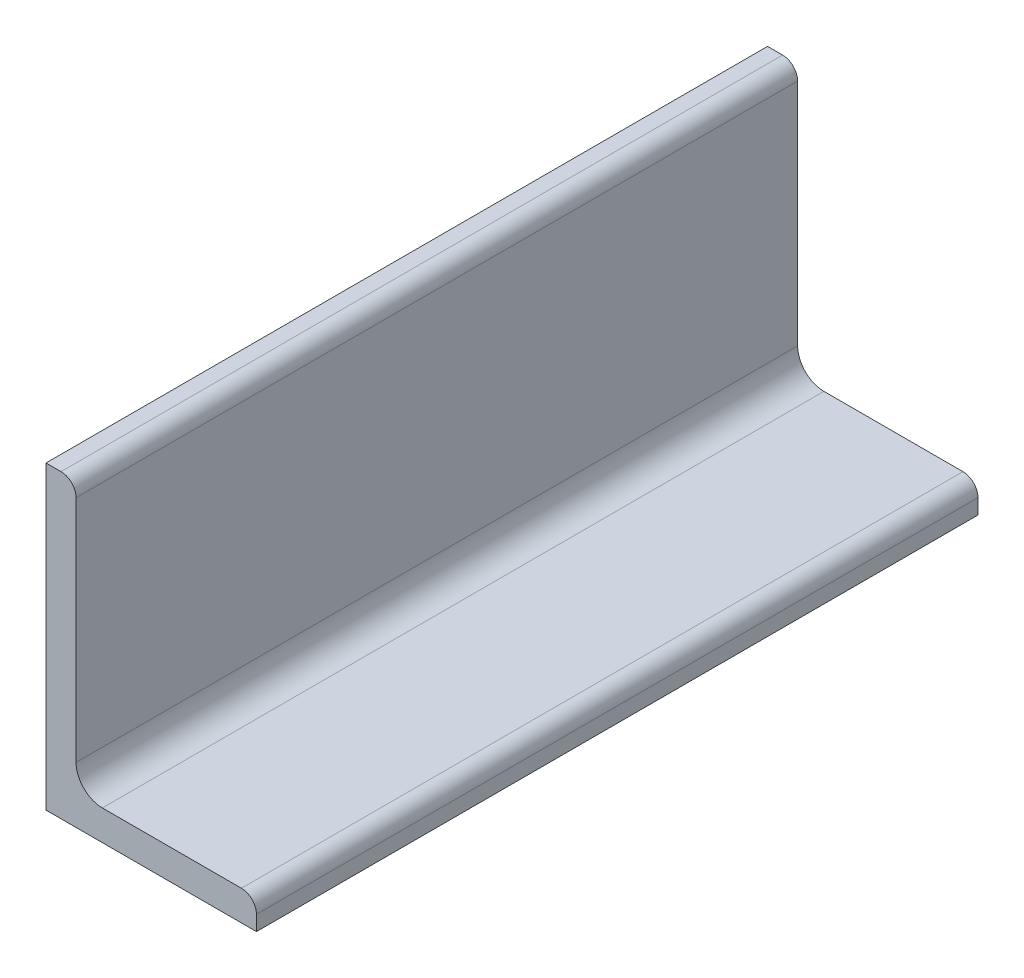
ISO-10303-21;
HEADER;
FILE_DESCRIPTION(('STEP AP214'),'2;1');
FILE_NAME('part.step','',(''),(''),'','','');
FILE_SCHEMA(('AUTOMOTIVE_DESIGN { 1 0 10303 214 1 1 1 1 }'));
ENDSEC;
DATA;
#1=APPLICATION_CONTEXT('core data for automotive mechanical design processes');
#2=APPLICATION_PROTOCOL_DEFINITION('international standard','automotive_design',2000,#1);
#3=PRODUCT_CONTEXT('',#1,'mechanical');
#4=PRODUCT('Part','Part','',(#3));
#5=PRODUCT_RELATED_PRODUCT_CATEGORY('part','',(#4));
#6=PRODUCT_DEFINITION_FORMATION('','',#4);
#7=PRODUCT_DEFINITION_CONTEXT('part definition',#1,'design');
#8=PRODUCT_DEFINITION('design','',#6,#7);
#9=PRODUCT_DEFINITION_SHAPE('','',#8);
#10=(LENGTH_UNIT() NAMED_UNIT(*) SI_UNIT(.MILLI.,.METRE.));
#11=(NAMED_UNIT(*) PLANE_ANGLE_UNIT() SI_UNIT($,.RADIAN.));
#12=(NAMED_UNIT(*) SI_UNIT($,.STERADIAN.) SOLID_ANGLE_UNIT());
#13=UNCERTAINTY_MEASURE_WITH_UNIT(LENGTH_MEASURE(1.E-05),#10,'distance_accuracy_value','');
#14=(GEOMETRIC_REPRESENTATION_CONTEXT(3) GLOBAL_UNCERTAINTY_ASSIGNED_CONTEXT((#13)) GLOBAL_UNIT_ASSIGNED_CONTEXT((#10,
#11,#12)) REPRESENTATION_CONTEXT('',''));
#15=CARTESIAN_POINT('',(0.,0.,0.));
#16=DIRECTION('',(0.,0.,1.));
#17=DIRECTION('',(1.,0.,0.));
#18=AXIS2_PLACEMENT_3D('',#15,#16,#17);
#19=CARTESIAN_POINT('',(0.0836264027816469,127.041655270204,304.8));
#20=DIRECTION('',(1.,0.,0.));
#21=DIRECTION('',(0.,0.,-1.));
#22=AXIS2_PLACEMENT_3D('',#19,#20,#21);
#23=PLANE('',#22);
#24=DIRECTION('',(0.,-1.,0.));
#25=VECTOR('',#24,1.);
#26=CARTESIAN_POINT('',(0.0836264027816469,127.041655270204,0.));
#27=LINE('',#26,#25);
#28=CARTESIAN_POINT('',(0.0836264027816469,127.041655270204,0.));
#29=VERTEX_POINT('',#28);
#30=CARTESIAN_POINT('',(0.0836264027816469,0.0416552702040917,0.));
#31=VERTEX_POINT('',#30);
#32=EDGE_CURVE('E135',#29,#31,#27,.T.);
#33=ORIENTED_EDGE('',*,*,#32,.T.);
#34=DIRECTION('',(0.,0.,-1.));
#35=VECTOR('',#34,1.);
#36=CARTESIAN_POINT('',(0.0836264027816469,0.0416552702040917,304.8));
#37=LINE('',#36,#35);
#38=CARTESIAN_POINT('',(0.0836264027816469,0.0416552702040917,304.8));
#39=VERTEX_POINT('',#38);
#40=EDGE_CURVE('E11',#39,#31,#37,.T.);
#41=ORIENTED_EDGE('',*,*,#40,.F.);
#42=DIRECTION('',(0.,-1.,0.));
#43=VECTOR('',#42,1.);
#44=CARTESIAN_POINT('',(0.0836264027816469,127.041655270204,304.8));
#45=LINE('',#44,#43);
#46=CARTESIAN_POINT('',(0.0836264027816469,127.041655270204,304.8));
#47=VERTEX_POINT('',#46);
#48=EDGE_CURVE('E151',#47,#39,#45,.T.);
#49=ORIENTED_EDGE('',*,*,#48,.F.);
#50=DIRECTION('',(0.,0.,-1.));
#51=VECTOR('',#50,1.);
#52=CARTESIAN_POINT('',(0.0836264027816469,127.041655270204,304.8));
#53=LINE('',#52,#51);
#54=EDGE_CURVE('E131',#47,#29,#53,.T.);
#55=ORIENTED_EDGE('',*,*,#54,.T.);
#56=EDGE_LOOP('',(#33,#41,#49,#55));
#57=FACE_BOUND('',#56,.T.);
#58=ADVANCED_FACE('F33',(#57),#23,.F.);
#59=CARTESIAN_POINT('',(0.0836264027816469,0.0416552702040917,304.8));
#60=DIRECTION('',(0.,1.,0.));
#61=DIRECTION('',(0.,0.,1.));
#62=AXIS2_PLACEMENT_3D('',#59,#60,#61);
#63=PLANE('',#62);
#64=DIRECTION('',(1.,0.,0.));
#65=VECTOR('',#64,1.);
#66=CARTESIAN_POINT('',(0.0836264027816469,0.0416552702040917,0.));
#67=LINE('',#66,#65);
#68=CARTESIAN_POINT('',(88.9836264027817,0.0416552702040917,0.));
#69=VERTEX_POINT('',#68);
#70=EDGE_CURVE('E138',#31,#69,#67,.T.);
#71=ORIENTED_EDGE('',*,*,#70,.T.);
#72=DIRECTION('',(0.,0.,-1.));
#73=VECTOR('',#72,1.);
#74=CARTESIAN_POINT('',(88.9836264027817,0.0416552702040917,304.8));
#75=LINE('',#74,#73);
#76=CARTESIAN_POINT('',(88.9836264027817,0.0416552702040917,304.8));
#77=VERTEX_POINT('',#76);
#78=EDGE_CURVE('E41',#77,#69,#75,.T.);
#79=ORIENTED_EDGE('',*,*,#78,.F.);
#80=DIRECTION('',(1.,0.,0.));
#81=VECTOR('',#80,1.);
#82=CARTESIAN_POINT('',(0.0836264027816469,0.0416552702040917,304.8));
#83=LINE('',#82,#81);
#84=EDGE_CURVE('E95',#39,#77,#83,.T.);
#85=ORIENTED_EDGE('',*,*,#84,.F.);
#86=ORIENTED_EDGE('',*,*,#40,.T.);
#87=EDGE_LOOP('',(#71,#79,#85,#86));
#88=FACE_BOUND('',#87,.T.);
#89=ADVANCED_FACE('F194',(#88),#63,.F.);
#90=CARTESIAN_POINT('',(88.9836264027817,0.0416552702040917,304.8));
#91=DIRECTION('',(-1.,0.,0.));
#92=DIRECTION('',(0.,0.,1.));
#93=AXIS2_PLACEMENT_3D('',#90,#91,#92);
#94=PLANE('',#93);
#95=DIRECTION('',(0.,1.,0.));
#96=VECTOR('',#95,1.);
#97=CARTESIAN_POINT('',(88.9836264027817,0.0416552702040917,0.));
#98=LINE('',#97,#96);
#99=CARTESIAN_POINT('',(88.9836264027817,6.39165527020409,0.));
#100=VERTEX_POINT('',#99);
#101=EDGE_CURVE('E140',#69,#100,#98,.T.);
#102=ORIENTED_EDGE('',*,*,#101,.T.);
#103=DIRECTION('',(0.,0.,-1.));
#104=VECTOR('',#103,1.);
#105=CARTESIAN_POINT('',(88.9836264027817,6.39165527020409,304.8));
#106=LINE('',#105,#104);
#107=CARTESIAN_POINT('',(88.9836264027817,6.39165527020409,304.8));
#108=VERTEX_POINT('',#107);
#109=EDGE_CURVE('E161',#108,#100,#106,.T.);
#110=ORIENTED_EDGE('',*,*,#109,.F.);
#111=DIRECTION('',(0.,1.,0.));
#112=VECTOR('',#111,1.);
#113=CARTESIAN_POINT('',(88.9836264027817,0.0416552702040917,304.8));
#114=LINE('',#113,#112);
#115=EDGE_CURVE('E169',#77,#108,#114,.T.);
#116=ORIENTED_EDGE('',*,*,#115,.F.);
#117=ORIENTED_EDGE('',*,*,#78,.T.);
#118=EDGE_LOOP('',(#102,#110,#116,#117));
#119=FACE_BOUND('',#118,.T.);
#120=ADVANCED_FACE('F167',(#119),#94,.F.);
#121=CARTESIAN_POINT('',(82.6336264027816,6.39165527020409,304.8));
#122=DIRECTION('',(0.,0.,-1.));
#123=DIRECTION('',(-1.,0.,0.));
#124=AXIS2_PLACEMENT_3D('',#121,#122,#123);
#125=CYLINDRICAL_SURFACE('',#124,6.35);
#126=CARTESIAN_POINT('',(82.6336264027816,6.39165527020409,0.));
#127=DIRECTION('',(0.,0.,1.));
#128=DIRECTION('',(1.,0.,0.));
#129=AXIS2_PLACEMENT_3D('',#126,#127,#128);
#130=CIRCLE('',#129,6.35);
#131=CARTESIAN_POINT('',(82.6336264027816,12.7416552702041,0.));
#132=VERTEX_POINT('',#131);
#133=EDGE_CURVE('E142',#100,#132,#130,.T.);
#134=ORIENTED_EDGE('',*,*,#133,.T.);
#135=DIRECTION('',(0.,0.,-1.));
#136=VECTOR('',#135,1.);
#137=CARTESIAN_POINT('',(82.6336264027816,12.7416552702041,304.8));
#138=LINE('',#137,#136);
#139=CARTESIAN_POINT('',(82.6336264027816,12.7416552702041,304.8));
#140=VERTEX_POINT('',#139);
#141=EDGE_CURVE('E158',#140,#132,#138,.T.);
#142=ORIENTED_EDGE('',*,*,#141,.F.);
#143=CARTESIAN_POINT('',(82.6336264027816,6.39165527020409,304.8));
#144=DIRECTION('',(0.,0.,1.));
#145=DIRECTION('',(1.,0.,0.));
#146=AXIS2_PLACEMENT_3D('',#143,#144,#145);
#147=CIRCLE('',#146,6.35);
#148=EDGE_CURVE('E185',#108,#140,#147,.T.);
#149=ORIENTED_EDGE('',*,*,#148,.F.);
#150=ORIENTED_EDGE('',*,*,#109,.T.);
#151=EDGE_LOOP('',(#134,#142,#149,#150));
#152=FACE_BOUND('',#151,.T.);
#153=ADVANCED_FACE('F178',(#152),#125,.T.);
#154=CARTESIAN_POINT('',(82.6336264027816,12.7416552702041,304.8));
#155=DIRECTION('',(0.,-1.,0.));
#156=DIRECTION('',(0.,0.,-1.));
#157=AXIS2_PLACEMENT_3D('',#154,#155,#156);
#158=PLANE('',#157);
#159=DIRECTION('',(-1.,0.,0.));
#160=VECTOR('',#159,1.);
#161=CARTESIAN_POINT('',(82.6336264027816,12.7416552702041,0.));
#162=LINE('',#161,#160);
#163=CARTESIAN_POINT('',(23.8961264027816,12.7416552702041,0.));
#164=VERTEX_POINT('',#163);
#165=EDGE_CURVE('E144',#132,#164,#162,.T.);
#166=ORIENTED_EDGE('',*,*,#165,.T.);
#167=DIRECTION('',(0.,0.,-1.));
#168=VECTOR('',#167,1.);
#169=CARTESIAN_POINT('',(23.8961264027816,12.7416552702041,304.8));
#170=LINE('',#169,#168);
#171=CARTESIAN_POINT('',(23.8961264027816,12.7416552702041,304.8));
#172=VERTEX_POINT('',#171);
#173=EDGE_CURVE('E155',#172,#164,#170,.T.);
#174=ORIENTED_EDGE('',*,*,#173,.F.);
#175=DIRECTION('',(-1.,0.,0.));
#176=VECTOR('',#175,1.);
#177=CARTESIAN_POINT('',(82.6336264027816,12.7416552702041,304.8));
#178=LINE('',#177,#176);
#179=EDGE_CURVE('E184',#140,#172,#178,.T.);
#180=ORIENTED_EDGE('',*,*,#179,.F.);
#181=ORIENTED_EDGE('',*,*,#141,.T.);
#182=EDGE_LOOP('',(#166,#174,#180,#181));
#183=FACE_BOUND('',#182,.T.);
#184=ADVANCED_FACE('F182',(#183),#158,.F.);
#185=CARTESIAN_POINT('',(23.8961264027816,23.8541552702041,304.8));
#186=DIRECTION('',(0.,0.,-1.));
#187=DIRECTION('',(-1.,0.,0.));
#188=AXIS2_PLACEMENT_3D('',#185,#186,#187);
#189=CYLINDRICAL_SURFACE('',#188,11.1125);
#190=CARTESIAN_POINT('',(23.8961264027816,23.8541552702041,0.));
#191=DIRECTION('',(0.,0.,-1.));
#192=DIRECTION('',(1.,0.,0.));
#193=AXIS2_PLACEMENT_3D('',#190,#191,#192);
#194=CIRCLE('',#193,11.1125);
#195=CARTESIAN_POINT('',(12.7836264027816,23.8541552702041,0.));
#196=VERTEX_POINT('',#195);
#197=EDGE_CURVE('E146',#164,#196,#194,.T.);
#198=ORIENTED_EDGE('',*,*,#197,.T.);
#199=DIRECTION('',(0.,0.,-1.));
#200=VECTOR('',#199,1.);
#201=CARTESIAN_POINT('',(12.7836264027816,23.8541552702041,304.8));
#202=LINE('',#201,#200);
#203=CARTESIAN_POINT('',(12.7836264027816,23.8541552702041,304.8));
#204=VERTEX_POINT('',#203);
#205=EDGE_CURVE('E126',#204,#196,#202,.T.);
#206=ORIENTED_EDGE('',*,*,#205,.F.);
#207=CARTESIAN_POINT('',(23.8961264027816,23.8541552702041,304.8));
#208=DIRECTION('',(0.,0.,-1.));
#209=DIRECTION('',(1.,0.,0.));
#210=AXIS2_PLACEMENT_3D('',#207,#208,#209);
#211=CIRCLE('',#210,11.1125);
#212=EDGE_CURVE('E117',#172,#204,#211,.T.);
#213=ORIENTED_EDGE('',*,*,#212,.F.);
#214=ORIENTED_EDGE('',*,*,#173,.T.);
#215=EDGE_LOOP('',(#198,#206,#213,#214));
#216=FACE_BOUND('',#215,.T.);
#217=ADVANCED_FACE('F206',(#216),#189,.F.);
#218=CARTESIAN_POINT('',(12.7836264027816,23.8541552702041,304.8));
#219=DIRECTION('',(-1.,0.,0.));
#220=DIRECTION('',(0.,0.,1.));
#221=AXIS2_PLACEMENT_3D('',#218,#219,#220);
#222=PLANE('',#221);
#223=DIRECTION('',(0.,1.,0.));
#224=VECTOR('',#223,1.);
#225=CARTESIAN_POINT('',(12.7836264027816,23.8541552702041,0.));
#226=LINE('',#225,#224);
#227=CARTESIAN_POINT('',(12.7836264027816,120.691655270204,0.));
#228=VERTEX_POINT('',#227);
#229=EDGE_CURVE('E125',#196,#228,#226,.T.);
#230=ORIENTED_EDGE('',*,*,#229,.T.);
#231=DIRECTION('',(0.,0.,-1.));
#232=VECTOR('',#231,1.);
#233=CARTESIAN_POINT('',(12.7836264027816,120.691655270204,304.8));
#234=LINE('',#233,#232);
#235=CARTESIAN_POINT('',(12.7836264027816,120.691655270204,304.8));
#236=VERTEX_POINT('',#235);
#237=EDGE_CURVE('E122',#236,#228,#234,.T.);
#238=ORIENTED_EDGE('',*,*,#237,.F.);
#239=DIRECTION('',(0.,1.,0.));
#240=VECTOR('',#239,1.);
#241=CARTESIAN_POINT('',(12.7836264027816,23.8541552702041,304.8));
#242=LINE('',#241,#240);
#243=EDGE_CURVE('E111',#204,#236,#242,.T.);
#244=ORIENTED_EDGE('',*,*,#243,.F.);
#245=ORIENTED_EDGE('',*,*,#205,.T.);
#246=EDGE_LOOP('',(#230,#238,#244,#245));
#247=FACE_BOUND('',#246,.T.);
#248=ADVANCED_FACE('F123',(#247),#222,.F.);
#249=CARTESIAN_POINT('',(6.43362640278165,120.691655270204,304.8));
#250=DIRECTION('',(0.,0.,-1.));
#251=DIRECTION('',(-1.,0.,0.));
#252=AXIS2_PLACEMENT_3D('',#249,#250,#251);
#253=CYLINDRICAL_SURFACE('',#252,6.35);
#254=CARTESIAN_POINT('',(6.43362640278165,120.691655270204,0.));
#255=DIRECTION('',(0.,0.,1.));
#256=DIRECTION('',(1.,0.,0.));
#257=AXIS2_PLACEMENT_3D('',#254,#255,#256);
#258=CIRCLE('',#257,6.35);
#259=CARTESIAN_POINT('',(6.43362640278165,127.041655270204,0.));
#260=VERTEX_POINT('',#259);
#261=EDGE_CURVE('E81',#228,#260,#258,.T.);
#262=ORIENTED_EDGE('',*,*,#261,.T.);
#263=DIRECTION('',(0.,0.,-1.));
#264=VECTOR('',#263,1.);
#265=CARTESIAN_POINT('',(6.43362640278165,127.041655270204,304.8));
#266=LINE('',#265,#264);
#267=CARTESIAN_POINT('',(6.43362640278165,127.041655270204,304.8));
#268=VERTEX_POINT('',#267);
#269=EDGE_CURVE('E127',#268,#260,#266,.T.);
#270=ORIENTED_EDGE('',*,*,#269,.F.);
#271=CARTESIAN_POINT('',(6.43362640278165,120.691655270204,304.8));
#272=DIRECTION('',(0.,0.,1.));
#273=DIRECTION('',(1.,0.,0.));
#274=AXIS2_PLACEMENT_3D('',#271,#272,#273);
#275=CIRCLE('',#274,6.35);
#276=EDGE_CURVE('E115',#236,#268,#275,.T.);
#277=ORIENTED_EDGE('',*,*,#276,.F.);
#278=ORIENTED_EDGE('',*,*,#237,.T.);
#279=EDGE_LOOP('',(#262,#270,#277,#278));
#280=FACE_BOUND('',#279,.T.);
#281=ADVANCED_FACE('F129',(#280),#253,.T.);
#282=CARTESIAN_POINT('',(6.43362640278165,127.041655270204,304.8));
#283=DIRECTION('',(0.,-1.,0.));
#284=DIRECTION('',(0.,0.,-1.));
#285=AXIS2_PLACEMENT_3D('',#282,#283,#284);
#286=PLANE('',#285);
#287=DIRECTION('',(-1.,0.,0.));
#288=VECTOR('',#287,1.);
#289=CARTESIAN_POINT('',(6.43362640278165,127.041655270204,0.));
#290=LINE('',#289,#288);
#291=EDGE_CURVE('E87',#260,#29,#290,.T.);
#292=ORIENTED_EDGE('',*,*,#291,.T.);
#293=ORIENTED_EDGE('',*,*,#54,.F.);
#294=DIRECTION('',(-1.,0.,0.));
#295=VECTOR('',#294,1.);
#296=CARTESIAN_POINT('',(6.43362640278165,127.041655270204,304.8));
#297=LINE('',#296,#295);
#298=EDGE_CURVE('E49',#268,#47,#297,.T.);
#299=ORIENTED_EDGE('',*,*,#298,.F.);
#300=ORIENTED_EDGE('',*,*,#269,.T.);
#301=EDGE_LOOP('',(#292,#293,#299,#300));
#302=FACE_BOUND('',#301,.T.);
#303=ADVANCED_FACE('F214',(#302),#286,.F.);
#304=CARTESIAN_POINT('',(82.6336264027816,6.39165527020409,304.8));
#305=DIRECTION('',(0.,0.,1.));
#306=DIRECTION('',(1.,0.,0.));
#307=AXIS2_PLACEMENT_3D('',#304,#305,#306);
#308=PLANE('',#307);
#309=ORIENTED_EDGE('',*,*,#48,.T.);
#310=ORIENTED_EDGE('',*,*,#84,.T.);
#311=ORIENTED_EDGE('',*,*,#115,.T.);
#312=ORIENTED_EDGE('',*,*,#148,.T.);
#313=ORIENTED_EDGE('',*,*,#179,.T.);
#314=ORIENTED_EDGE('',*,*,#212,.T.);
#315=ORIENTED_EDGE('',*,*,#243,.T.);
#316=ORIENTED_EDGE('',*,*,#276,.T.);
#317=ORIENTED_EDGE('',*,*,#298,.T.);
#318=EDGE_LOOP('',(#309,#310,#311,#312,#313,#314,#315,#316,#317));
#319=FACE_BOUND('',#318,.T.);
#320=ADVANCED_FACE('F113',(#319),#308,.T.);
#321=CARTESIAN_POINT('',(82.6336264027816,6.39165527020409,0.));
#322=DIRECTION('',(0.,0.,1.));
#323=DIRECTION('',(1.,0.,0.));
#324=AXIS2_PLACEMENT_3D('',#321,#322,#323);
#325=PLANE('',#324);
#326=ORIENTED_EDGE('',*,*,#32,.F.);
#327=ORIENTED_EDGE('',*,*,#291,.F.);
#328=ORIENTED_EDGE('',*,*,#261,.F.);
#329=ORIENTED_EDGE('',*,*,#229,.F.);
#330=ORIENTED_EDGE('',*,*,#197,.F.);
#331=ORIENTED_EDGE('',*,*,#165,.F.);
#332=ORIENTED_EDGE('',*,*,#133,.F.);
#333=ORIENTED_EDGE('',*,*,#101,.F.);
#334=ORIENTED_EDGE('',*,*,#70,.F.);
#335=EDGE_LOOP('',(#326,#327,#328,#329,#330,#331,#332,#333,#334));
#336=FACE_BOUND('',#335,.T.);
#337=ADVANCED_FACE('F173',(#336),#325,.F.);
#338=CLOSED_SHELL('',(#58,#89,#120,#153,#184,#217,#248,#281,#303,#320,#337));
#339=MANIFOLD_SOLID_BREP('B2',#338);
#340=ADVANCED_BREP_SHAPE_REPRESENTATION('',(#18,#339),#14);
#341=SHAPE_DEFINITION_REPRESENTATION(#9,#340);
ENDSEC;
END-ISO-10303-21;
